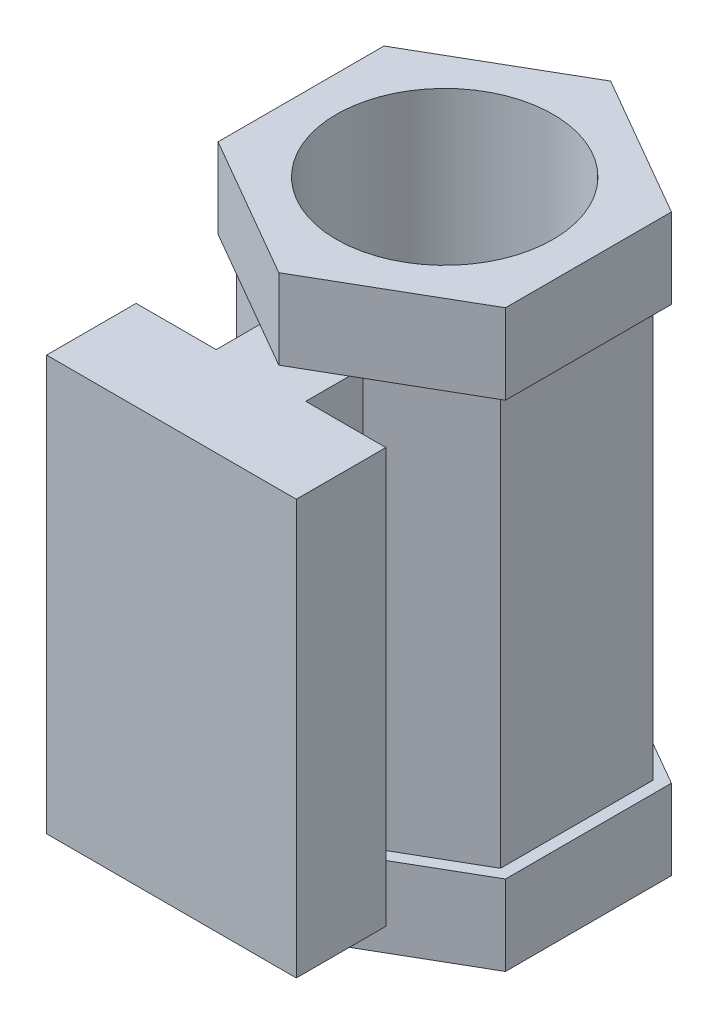
ISO-10303-21;
HEADER;
FILE_DESCRIPTION(('STEP AP214'),'2;1');
FILE_NAME('part.step','',(''),(''),'','','');
FILE_SCHEMA(('AUTOMOTIVE_DESIGN { 1 0 10303 214 1 1 1 1 }'));
ENDSEC;
DATA;
#1=APPLICATION_CONTEXT('core data for automotive mechanical design processes');
#2=APPLICATION_PROTOCOL_DEFINITION('international standard','automotive_design',2000,#1);
#3=PRODUCT_CONTEXT('',#1,'mechanical');
#4=PRODUCT('Part','Part','',(#3));
#5=PRODUCT_RELATED_PRODUCT_CATEGORY('part','',(#4));
#6=PRODUCT_DEFINITION_FORMATION('','',#4);
#7=PRODUCT_DEFINITION_CONTEXT('part definition',#1,'design');
#8=PRODUCT_DEFINITION('design','',#6,#7);
#9=PRODUCT_DEFINITION_SHAPE('','',#8);
#10=(LENGTH_UNIT() NAMED_UNIT(*) SI_UNIT(.MILLI.,.METRE.));
#11=(NAMED_UNIT(*) PLANE_ANGLE_UNIT() SI_UNIT($,.RADIAN.));
#12=(NAMED_UNIT(*) SI_UNIT($,.STERADIAN.) SOLID_ANGLE_UNIT());
#13=UNCERTAINTY_MEASURE_WITH_UNIT(LENGTH_MEASURE(1.E-05),#10,'distance_accuracy_value','');
#14=(GEOMETRIC_REPRESENTATION_CONTEXT(3) GLOBAL_UNCERTAINTY_ASSIGNED_CONTEXT((#13)) GLOBAL_UNIT_ASSIGNED_CONTEXT((#10,
#11,#12)) REPRESENTATION_CONTEXT('',''));
#15=CARTESIAN_POINT('',(0.,0.,0.));
#16=DIRECTION('',(0.,0.,1.));
#17=DIRECTION('',(1.,0.,0.));
#18=AXIS2_PLACEMENT_3D('',#15,#16,#17);
#19=CARTESIAN_POINT('',(152.5,85.,-88.045916051418));
#20=DIRECTION('',(-0.5,0.,0.866025403784439));
#21=DIRECTION('',(0.866025403784439,0.,0.5));
#22=AXIS2_PLACEMENT_3D('',#19,#20,#21);
#23=PLANE('',#22);
#24=DIRECTION('',(-0.866025403784439,0.,-0.5));
#25=VECTOR('',#24,1.);
#26=CARTESIAN_POINT('',(152.5,0.,-88.045916051418));
#27=LINE('',#26,#25);
#28=CARTESIAN_POINT('',(152.5,0.,-88.045916051418));
#29=VERTEX_POINT('',#28);
#30=CARTESIAN_POINT('',(0.,0.,-176.091832102836));
#31=VERTEX_POINT('',#30);
#32=EDGE_CURVE('E325',#29,#31,#27,.T.);
#33=ORIENTED_EDGE('',*,*,#32,.T.);
#34=DIRECTION('',(0.,-1.,0.));
#35=VECTOR('',#34,1.);
#36=CARTESIAN_POINT('',(0.,85.,-176.091832102836));
#37=LINE('',#36,#35);
#38=CARTESIAN_POINT('',(0.,85.,-176.091832102836));
#39=VERTEX_POINT('',#38);
#40=EDGE_CURVE('E38',#39,#31,#37,.T.);
#41=ORIENTED_EDGE('',*,*,#40,.F.);
#42=DIRECTION('',(-0.866025403784439,0.,-0.5));
#43=VECTOR('',#42,1.);
#44=CARTESIAN_POINT('',(152.5,85.,-88.045916051418));
#45=LINE('',#44,#43);
#46=CARTESIAN_POINT('',(152.5,85.,-88.045916051418));
#47=VERTEX_POINT('',#46);
#48=EDGE_CURVE('E350',#47,#39,#45,.T.);
#49=ORIENTED_EDGE('',*,*,#48,.F.);
#50=DIRECTION('',(0.,-1.,0.));
#51=VECTOR('',#50,1.);
#52=CARTESIAN_POINT('',(152.5,85.,-88.045916051418));
#53=LINE('',#52,#51);
#54=EDGE_CURVE('E364',#47,#29,#53,.T.);
#55=ORIENTED_EDGE('',*,*,#54,.T.);
#56=EDGE_LOOP('',(#33,#41,#49,#55));
#57=FACE_BOUND('',#56,.T.);
#58=ADVANCED_FACE('F35',(#57),#23,.F.);
#59=CARTESIAN_POINT('',(0.,85.,-176.091832102836));
#60=DIRECTION('',(0.5,0.,0.866025403784439));
#61=DIRECTION('',(0.866025403784439,0.,-0.5));
#62=AXIS2_PLACEMENT_3D('',#59,#60,#61);
#63=PLANE('',#62);
#64=DIRECTION('',(-0.866025403784438,0.,0.5));
#65=VECTOR('',#64,1.);
#66=CARTESIAN_POINT('',(0.,0.,-176.091832102836));
#67=LINE('',#66,#65);
#68=CARTESIAN_POINT('',(-152.5,0.,-88.045916051418));
#69=VERTEX_POINT('',#68);
#70=EDGE_CURVE('E367',#31,#69,#67,.T.);
#71=ORIENTED_EDGE('',*,*,#70,.T.);
#72=DIRECTION('',(0.,-1.,0.));
#73=VECTOR('',#72,1.);
#74=CARTESIAN_POINT('',(-152.5,85.,-88.045916051418));
#75=LINE('',#74,#73);
#76=CARTESIAN_POINT('',(-152.5,85.,-88.045916051418));
#77=VERTEX_POINT('',#76);
#78=EDGE_CURVE('E390',#77,#69,#75,.T.);
#79=ORIENTED_EDGE('',*,*,#78,.F.);
#80=DIRECTION('',(-0.866025403784438,0.,0.5));
#81=VECTOR('',#80,1.);
#82=CARTESIAN_POINT('',(0.,85.,-176.091832102836));
#83=LINE('',#82,#81);
#84=EDGE_CURVE('E353',#39,#77,#83,.T.);
#85=ORIENTED_EDGE('',*,*,#84,.F.);
#86=ORIENTED_EDGE('',*,*,#40,.T.);
#87=EDGE_LOOP('',(#71,#79,#85,#86));
#88=FACE_BOUND('',#87,.T.);
#89=ADVANCED_FACE('F509',(#88),#63,.F.);
#90=CARTESIAN_POINT('',(-152.5,85.,-88.045916051418));
#91=DIRECTION('',(1.,0.,0.));
#92=DIRECTION('',(0.,0.,-1.));
#93=AXIS2_PLACEMENT_3D('',#90,#91,#92);
#94=PLANE('',#93);
#95=DIRECTION('',(0.,0.,1.));
#96=VECTOR('',#95,1.);
#97=CARTESIAN_POINT('',(-152.5,0.,-88.045916051418));
#98=LINE('',#97,#96);
#99=CARTESIAN_POINT('',(-152.5,0.,88.0459160514179));
#100=VERTEX_POINT('',#99);
#101=EDGE_CURVE('E369',#69,#100,#98,.T.);
#102=ORIENTED_EDGE('',*,*,#101,.T.);
#103=DIRECTION('',(0.,-1.,0.));
#104=VECTOR('',#103,1.);
#105=CARTESIAN_POINT('',(-152.5,85.,88.0459160514179));
#106=LINE('',#105,#104);
#107=CARTESIAN_POINT('',(-152.5,85.,88.0459160514179));
#108=VERTEX_POINT('',#107);
#109=EDGE_CURVE('E388',#108,#100,#106,.T.);
#110=ORIENTED_EDGE('',*,*,#109,.F.);
#111=DIRECTION('',(0.,0.,1.));
#112=VECTOR('',#111,1.);
#113=CARTESIAN_POINT('',(-152.5,85.,-88.045916051418));
#114=LINE('',#113,#112);
#115=EDGE_CURVE('E356',#77,#108,#114,.T.);
#116=ORIENTED_EDGE('',*,*,#115,.F.);
#117=ORIENTED_EDGE('',*,*,#78,.T.);
#118=EDGE_LOOP('',(#102,#110,#116,#117));
#119=FACE_BOUND('',#118,.T.);
#120=ADVANCED_FACE('F511',(#119),#94,.F.);
#121=CARTESIAN_POINT('',(-152.5,85.,88.0459160514179));
#122=DIRECTION('',(0.5,0.,-0.866025403784439));
#123=DIRECTION('',(-0.866025403784439,0.,-0.5));
#124=AXIS2_PLACEMENT_3D('',#121,#122,#123);
#125=PLANE('',#124);
#126=DIRECTION('',(0.866025403784438,0.,0.5));
#127=VECTOR('',#126,1.);
#128=CARTESIAN_POINT('',(-152.5,0.,88.0459160514179));
#129=LINE('',#128,#127);
#130=CARTESIAN_POINT('',(-47.5,0.,148.667694316329));
#131=VERTEX_POINT('',#130);
#132=EDGE_CURVE('E372',#100,#131,#129,.T.);
#133=ORIENTED_EDGE('',*,*,#132,.T.);
#134=CARTESIAN_POINT('',(0.,0.,176.091832102836));
#135=VERTEX_POINT('',#134);
#136=EDGE_CURVE('E371',#131,#135,#129,.T.);
#137=ORIENTED_EDGE('',*,*,#136,.T.);
#138=DIRECTION('',(0.,-1.,0.));
#139=VECTOR('',#138,1.);
#140=CARTESIAN_POINT('',(0.,85.,176.091832102836));
#141=LINE('',#140,#139);
#142=CARTESIAN_POINT('',(0.,85.,176.091832102836));
#143=VERTEX_POINT('',#142);
#144=EDGE_CURVE('E385',#143,#135,#141,.T.);
#145=ORIENTED_EDGE('',*,*,#144,.F.);
#146=DIRECTION('',(0.866025403784438,0.,0.5));
#147=VECTOR('',#146,1.);
#148=CARTESIAN_POINT('',(-152.5,85.,88.0459160514179));
#149=LINE('',#148,#147);
#150=EDGE_CURVE('E358',#108,#143,#149,.T.);
#151=ORIENTED_EDGE('',*,*,#150,.F.);
#152=ORIENTED_EDGE('',*,*,#109,.T.);
#153=EDGE_LOOP('',(#133,#137,#145,#151,#152));
#154=FACE_BOUND('',#153,.T.);
#155=ADVANCED_FACE('F517',(#154),#125,.F.);
#156=CARTESIAN_POINT('',(0.,85.,176.091832102836));
#157=DIRECTION('',(-0.5,0.,-0.866025403784439));
#158=DIRECTION('',(-0.866025403784439,0.,0.5));
#159=AXIS2_PLACEMENT_3D('',#156,#157,#158);
#160=PLANE('',#159);
#161=DIRECTION('',(0.866025403784439,0.,-0.5));
#162=VECTOR('',#161,1.);
#163=CARTESIAN_POINT('',(0.,0.,176.091832102836));
#164=LINE('',#163,#162);
#165=CARTESIAN_POINT('',(47.5,0.,148.667694316329));
#166=VERTEX_POINT('',#165);
#167=EDGE_CURVE('E376',#135,#166,#164,.T.);
#168=ORIENTED_EDGE('',*,*,#167,.T.);
#169=CARTESIAN_POINT('',(152.5,0.,88.0459160514179));
#170=VERTEX_POINT('',#169);
#171=EDGE_CURVE('E375',#166,#170,#164,.T.);
#172=ORIENTED_EDGE('',*,*,#171,.T.);
#173=DIRECTION('',(0.,-1.,0.));
#174=VECTOR('',#173,1.);
#175=CARTESIAN_POINT('',(152.5,85.,88.0459160514179));
#176=LINE('',#175,#174);
#177=CARTESIAN_POINT('',(152.5,85.,88.0459160514179));
#178=VERTEX_POINT('',#177);
#179=EDGE_CURVE('E382',#178,#170,#176,.T.);
#180=ORIENTED_EDGE('',*,*,#179,.F.);
#181=DIRECTION('',(0.866025403784439,0.,-0.5));
#182=VECTOR('',#181,1.);
#183=CARTESIAN_POINT('',(0.,85.,176.091832102836));
#184=LINE('',#183,#182);
#185=EDGE_CURVE('E360',#143,#178,#184,.T.);
#186=ORIENTED_EDGE('',*,*,#185,.F.);
#187=ORIENTED_EDGE('',*,*,#144,.T.);
#188=EDGE_LOOP('',(#168,#172,#180,#186,#187));
#189=FACE_BOUND('',#188,.T.);
#190=ADVANCED_FACE('F519',(#189),#160,.F.);
#191=CARTESIAN_POINT('',(152.5,85.,88.0459160514179));
#192=DIRECTION('',(-1.,0.,0.));
#193=DIRECTION('',(0.,0.,1.));
#194=AXIS2_PLACEMENT_3D('',#191,#192,#193);
#195=PLANE('',#194);
#196=DIRECTION('',(0.,0.,-1.));
#197=VECTOR('',#196,1.);
#198=CARTESIAN_POINT('',(152.5,0.,88.0459160514179));
#199=LINE('',#198,#197);
#200=EDGE_CURVE('E354',#170,#29,#199,.T.);
#201=ORIENTED_EDGE('',*,*,#200,.T.);
#202=ORIENTED_EDGE('',*,*,#54,.F.);
#203=DIRECTION('',(0.,0.,-1.));
#204=VECTOR('',#203,1.);
#205=CARTESIAN_POINT('',(152.5,85.,88.0459160514179));
#206=LINE('',#205,#204);
#207=EDGE_CURVE('E362',#178,#47,#206,.T.);
#208=ORIENTED_EDGE('',*,*,#207,.F.);
#209=ORIENTED_EDGE('',*,*,#179,.T.);
#210=EDGE_LOOP('',(#201,#202,#208,#209));
#211=FACE_BOUND('',#210,.T.);
#212=ADVANCED_FACE('F501',(#211),#195,.F.);
#213=CARTESIAN_POINT('',(0.,85.,0.));
#214=DIRECTION('',(0.,1.,0.));
#215=DIRECTION('',(0.,0.,1.));
#216=AXIS2_PLACEMENT_3D('',#213,#214,#215);
#217=PLANE('',#216);
#218=CARTESIAN_POINT('',(0.,85.,0.));
#219=DIRECTION('',(0.,1.,0.));
#220=DIRECTION('',(0.,0.,1.));
#221=AXIS2_PLACEMENT_3D('',#218,#219,#220);
#222=CIRCLE('',#221,115.);
#223=CARTESIAN_POINT('',(0.,85.,115.));
#224=VERTEX_POINT('',#223);
#225=EDGE_CURVE('E485',#224,#224,#222,.T.);
#226=ORIENTED_EDGE('',*,*,#225,.F.);
#227=EDGE_LOOP('',(#226));
#228=FACE_BOUND('',#227,.T.);
#229=ORIENTED_EDGE('',*,*,#48,.T.);
#230=ORIENTED_EDGE('',*,*,#84,.T.);
#231=ORIENTED_EDGE('',*,*,#115,.T.);
#232=ORIENTED_EDGE('',*,*,#150,.T.);
#233=ORIENTED_EDGE('',*,*,#185,.T.);
#234=ORIENTED_EDGE('',*,*,#207,.T.);
#235=EDGE_LOOP('',(#229,#230,#231,#232,#233,#234));
#236=FACE_BOUND('',#235,.T.);
#237=ADVANCED_FACE('F498',(#228,#236),#217,.T.);
#238=CARTESIAN_POINT('',(0.,0.,0.));
#239=DIRECTION('',(0.,1.,0.));
#240=DIRECTION('',(0.,0.,1.));
#241=AXIS2_PLACEMENT_3D('',#238,#239,#240);
#242=PLANE('',#241);
#243=ORIENTED_EDGE('',*,*,#171,.F.);
#244=DIRECTION('',(0.,0.,-1.));
#245=VECTOR('',#244,1.);
#246=CARTESIAN_POINT('',(47.5,0.,195.));
#247=LINE('',#246,#245);
#248=CARTESIAN_POINT('',(47.5,0.,134.233937586588));
#249=VERTEX_POINT('',#248);
#250=EDGE_CURVE('E43',#166,#249,#247,.T.);
#251=ORIENTED_EDGE('',*,*,#250,.T.);
#252=DIRECTION('',(0.866025403784439,0.,-0.5));
#253=VECTOR('',#252,1.);
#254=CARTESIAN_POINT('',(47.5,0.,134.233937586588));
#255=LINE('',#254,#253);
#256=CARTESIAN_POINT('',(140.,0.,80.8290376865476));
#257=VERTEX_POINT('',#256);
#258=EDGE_CURVE('E290',#249,#257,#255,.T.);
#259=ORIENTED_EDGE('',*,*,#258,.T.);
#260=DIRECTION('',(0.,0.,-1.));
#261=VECTOR('',#260,1.);
#262=CARTESIAN_POINT('',(140.,0.,80.8290376865476));
#263=LINE('',#262,#261);
#264=CARTESIAN_POINT('',(140.,0.,-80.8290376865477));
#265=VERTEX_POINT('',#264);
#266=EDGE_CURVE('E293',#257,#265,#263,.T.);
#267=ORIENTED_EDGE('',*,*,#266,.T.);
#268=DIRECTION('',(-0.866025403784439,0.,-0.5));
#269=VECTOR('',#268,1.);
#270=CARTESIAN_POINT('',(140.,0.,-80.8290376865477));
#271=LINE('',#270,#269);
#272=CARTESIAN_POINT('',(0.,0.,-161.658075373095));
#273=VERTEX_POINT('',#272);
#274=EDGE_CURVE('E296',#265,#273,#271,.T.);
#275=ORIENTED_EDGE('',*,*,#274,.T.);
#276=DIRECTION('',(-0.866025403784439,0.,0.5));
#277=VECTOR('',#276,1.);
#278=CARTESIAN_POINT('',(0.,0.,-161.658075373095));
#279=LINE('',#278,#277);
#280=CARTESIAN_POINT('',(-140.,0.,-80.8290376865477));
#281=VERTEX_POINT('',#280);
#282=EDGE_CURVE('E299',#273,#281,#279,.T.);
#283=ORIENTED_EDGE('',*,*,#282,.T.);
#284=DIRECTION('',(0.,0.,1.));
#285=VECTOR('',#284,1.);
#286=CARTESIAN_POINT('',(-140.,0.,-80.8290376865477));
#287=LINE('',#286,#285);
#288=CARTESIAN_POINT('',(-140.,0.,80.8290376865476));
#289=VERTEX_POINT('',#288);
#290=EDGE_CURVE('E302',#281,#289,#287,.T.);
#291=ORIENTED_EDGE('',*,*,#290,.T.);
#292=DIRECTION('',(0.866025403784439,0.,0.5));
#293=VECTOR('',#292,1.);
#294=CARTESIAN_POINT('',(-140.,0.,80.8290376865476));
#295=LINE('',#294,#293);
#296=CARTESIAN_POINT('',(-47.5,0.,134.233937586588));
#297=VERTEX_POINT('',#296);
#298=EDGE_CURVE('E305',#289,#297,#295,.T.);
#299=ORIENTED_EDGE('',*,*,#298,.T.);
#300=DIRECTION('',(0.,0.,1.));
#301=VECTOR('',#300,1.);
#302=CARTESIAN_POINT('',(-47.5,0.,195.));
#303=LINE('',#302,#301);
#304=EDGE_CURVE('E309',#297,#131,#303,.T.);
#305=ORIENTED_EDGE('',*,*,#304,.T.);
#306=ORIENTED_EDGE('',*,*,#132,.F.);
#307=ORIENTED_EDGE('',*,*,#101,.F.);
#308=ORIENTED_EDGE('',*,*,#70,.F.);
#309=ORIENTED_EDGE('',*,*,#32,.F.);
#310=ORIENTED_EDGE('',*,*,#200,.F.);
#311=EDGE_LOOP('',(#243,#251,#259,#267,#275,#283,#291,#299,#305,#306,#307,#308,#309,#310));
#312=FACE_BOUND('',#311,.T.);
#313=ADVANCED_FACE('F402',(#312),#242,.F.);
#314=CARTESIAN_POINT('',(132.5,-440.,195.));
#315=DIRECTION('',(0.,0.,-1.));
#316=DIRECTION('',(-1.,0.,0.));
#317=AXIS2_PLACEMENT_3D('',#314,#315,#316);
#318=PLANE('',#317);
#319=DIRECTION('',(-1.,0.,0.));
#320=VECTOR('',#319,1.);
#321=CARTESIAN_POINT('',(132.5,0.,195.));
#322=LINE('',#321,#320);
#323=CARTESIAN_POINT('',(132.5,0.,195.));
#324=VERTEX_POINT('',#323);
#325=CARTESIAN_POINT('',(47.5,0.,195.));
#326=VERTEX_POINT('',#325);
#327=EDGE_CURVE('E239',#324,#326,#322,.T.);
#328=ORIENTED_EDGE('',*,*,#327,.F.);
#329=DIRECTION('',(0.,1.,0.));
#330=VECTOR('',#329,1.);
#331=CARTESIAN_POINT('',(132.5,-440.,195.));
#332=LINE('',#331,#330);
#333=CARTESIAN_POINT('',(132.5,-440.,195.));
#334=VERTEX_POINT('',#333);
#335=EDGE_CURVE('E323',#334,#324,#332,.T.);
#336=ORIENTED_EDGE('',*,*,#335,.F.);
#337=DIRECTION('',(-1.,0.,0.));
#338=VECTOR('',#337,1.);
#339=CARTESIAN_POINT('',(132.5,-440.,195.));
#340=LINE('',#339,#338);
#341=CARTESIAN_POINT('',(47.5,-440.,195.));
#342=VERTEX_POINT('',#341);
#343=EDGE_CURVE('E248',#334,#342,#340,.T.);
#344=ORIENTED_EDGE('',*,*,#343,.T.);
#345=DIRECTION('',(0.,1.,0.));
#346=VECTOR('',#345,1.);
#347=CARTESIAN_POINT('',(47.5,-440.,195.));
#348=LINE('',#347,#346);
#349=EDGE_CURVE('E286',#342,#326,#348,.T.);
#350=ORIENTED_EDGE('',*,*,#349,.T.);
#351=EDGE_LOOP('',(#328,#336,#344,#350));
#352=FACE_BOUND('',#351,.T.);
#353=ADVANCED_FACE('F416',(#352),#318,.T.);
#354=CARTESIAN_POINT('',(132.5,-440.,290.));
#355=DIRECTION('',(1.,0.,0.));
#356=DIRECTION('',(0.,0.,-1.));
#357=AXIS2_PLACEMENT_3D('',#354,#355,#356);
#358=PLANE('',#357);
#359=DIRECTION('',(0.,0.,-1.));
#360=VECTOR('',#359,1.);
#361=CARTESIAN_POINT('',(132.5,0.,290.));
#362=LINE('',#361,#360);
#363=CARTESIAN_POINT('',(132.5,0.,290.));
#364=VERTEX_POINT('',#363);
#365=EDGE_CURVE('E252',#364,#324,#362,.T.);
#366=ORIENTED_EDGE('',*,*,#365,.F.);
#367=DIRECTION('',(0.,1.,0.));
#368=VECTOR('',#367,1.);
#369=CARTESIAN_POINT('',(132.5,-440.,290.));
#370=LINE('',#369,#368);
#371=CARTESIAN_POINT('',(132.5,-440.,290.));
#372=VERTEX_POINT('',#371);
#373=EDGE_CURVE('E326',#372,#364,#370,.T.);
#374=ORIENTED_EDGE('',*,*,#373,.F.);
#375=DIRECTION('',(0.,0.,-1.));
#376=VECTOR('',#375,1.);
#377=CARTESIAN_POINT('',(132.5,-440.,290.));
#378=LINE('',#377,#376);
#379=EDGE_CURVE('E284',#372,#334,#378,.T.);
#380=ORIENTED_EDGE('',*,*,#379,.T.);
#381=ORIENTED_EDGE('',*,*,#335,.T.);
#382=EDGE_LOOP('',(#366,#374,#380,#381));
#383=FACE_BOUND('',#382,.T.);
#384=ADVANCED_FACE('F423',(#383),#358,.T.);
#385=CARTESIAN_POINT('',(132.5,-440.,290.));
#386=DIRECTION('',(0.,0.,1.));
#387=DIRECTION('',(1.,0.,0.));
#388=AXIS2_PLACEMENT_3D('',#385,#386,#387);
#389=PLANE('',#388);
#390=DIRECTION('',(1.,0.,0.));
#391=VECTOR('',#390,1.);
#392=CARTESIAN_POINT('',(132.5,0.,290.));
#393=LINE('',#392,#391);
#394=CARTESIAN_POINT('',(-132.5,0.,290.));
#395=VERTEX_POINT('',#394);
#396=EDGE_CURVE('E318',#395,#364,#393,.T.);
#397=ORIENTED_EDGE('',*,*,#396,.F.);
#398=DIRECTION('',(0.,1.,0.));
#399=VECTOR('',#398,1.);
#400=CARTESIAN_POINT('',(-132.5,-440.,290.));
#401=LINE('',#400,#399);
#402=CARTESIAN_POINT('',(-132.5,-440.,290.));
#403=VERTEX_POINT('',#402);
#404=EDGE_CURVE('E328',#403,#395,#401,.T.);
#405=ORIENTED_EDGE('',*,*,#404,.F.);
#406=DIRECTION('',(1.,0.,0.));
#407=VECTOR('',#406,1.);
#408=CARTESIAN_POINT('',(132.5,-440.,290.));
#409=LINE('',#408,#407);
#410=EDGE_CURVE('E281',#403,#372,#409,.T.);
#411=ORIENTED_EDGE('',*,*,#410,.T.);
#412=ORIENTED_EDGE('',*,*,#373,.T.);
#413=EDGE_LOOP('',(#397,#405,#411,#412));
#414=FACE_BOUND('',#413,.T.);
#415=ADVANCED_FACE('F426',(#414),#389,.T.);
#416=CARTESIAN_POINT('',(-132.5,-440.,290.));
#417=DIRECTION('',(-1.,0.,0.));
#418=DIRECTION('',(0.,0.,1.));
#419=AXIS2_PLACEMENT_3D('',#416,#417,#418);
#420=PLANE('',#419);
#421=DIRECTION('',(0.,0.,1.));
#422=VECTOR('',#421,1.);
#423=CARTESIAN_POINT('',(-132.5,0.,290.));
#424=LINE('',#423,#422);
#425=CARTESIAN_POINT('',(-132.5,0.,195.));
#426=VERTEX_POINT('',#425);
#427=EDGE_CURVE('E315',#426,#395,#424,.T.);
#428=ORIENTED_EDGE('',*,*,#427,.F.);
#429=DIRECTION('',(0.,1.,0.));
#430=VECTOR('',#429,1.);
#431=CARTESIAN_POINT('',(-132.5,-440.,195.));
#432=LINE('',#431,#430);
#433=CARTESIAN_POINT('',(-132.5,-440.,195.));
#434=VERTEX_POINT('',#433);
#435=EDGE_CURVE('E330',#434,#426,#432,.T.);
#436=ORIENTED_EDGE('',*,*,#435,.F.);
#437=DIRECTION('',(0.,0.,1.));
#438=VECTOR('',#437,1.);
#439=CARTESIAN_POINT('',(-132.5,-440.,290.));
#440=LINE('',#439,#438);
#441=EDGE_CURVE('E278',#434,#403,#440,.T.);
#442=ORIENTED_EDGE('',*,*,#441,.T.);
#443=ORIENTED_EDGE('',*,*,#404,.T.);
#444=EDGE_LOOP('',(#428,#436,#442,#443));
#445=FACE_BOUND('',#444,.T.);
#446=ADVANCED_FACE('F430',(#445),#420,.T.);
#447=CARTESIAN_POINT('',(-132.5,-440.,195.));
#448=DIRECTION('',(0.,0.,-1.));
#449=DIRECTION('',(-1.,0.,0.));
#450=AXIS2_PLACEMENT_3D('',#447,#448,#449);
#451=PLANE('',#450);
#452=DIRECTION('',(-1.,0.,0.));
#453=VECTOR('',#452,1.);
#454=CARTESIAN_POINT('',(-132.5,0.,195.));
#455=LINE('',#454,#453);
#456=CARTESIAN_POINT('',(-47.5,0.,195.));
#457=VERTEX_POINT('',#456);
#458=EDGE_CURVE('E312',#457,#426,#455,.T.);
#459=ORIENTED_EDGE('',*,*,#458,.F.);
#460=DIRECTION('',(0.,1.,0.));
#461=VECTOR('',#460,1.);
#462=CARTESIAN_POINT('',(-47.5,-440.,195.));
#463=LINE('',#462,#461);
#464=CARTESIAN_POINT('',(-47.5,-440.,195.));
#465=VERTEX_POINT('',#464);
#466=EDGE_CURVE('E332',#465,#457,#463,.T.);
#467=ORIENTED_EDGE('',*,*,#466,.F.);
#468=DIRECTION('',(-1.,0.,0.));
#469=VECTOR('',#468,1.);
#470=CARTESIAN_POINT('',(-132.5,-440.,195.));
#471=LINE('',#470,#469);
#472=EDGE_CURVE('E275',#465,#434,#471,.T.);
#473=ORIENTED_EDGE('',*,*,#472,.T.);
#474=ORIENTED_EDGE('',*,*,#435,.T.);
#475=EDGE_LOOP('',(#459,#467,#473,#474));
#476=FACE_BOUND('',#475,.T.);
#477=ADVANCED_FACE('F433',(#476),#451,.T.);
#478=CARTESIAN_POINT('',(-47.5,-440.,195.));
#479=DIRECTION('',(-1.,0.,0.));
#480=DIRECTION('',(0.,0.,1.));
#481=AXIS2_PLACEMENT_3D('',#478,#479,#480);
#482=PLANE('',#481);
#483=ORIENTED_EDGE('',*,*,#304,.F.);
#484=DIRECTION('',(0.,1.,0.));
#485=VECTOR('',#484,1.);
#486=CARTESIAN_POINT('',(-47.5,-440.,134.233937586588));
#487=LINE('',#486,#485);
#488=CARTESIAN_POINT('',(-47.5,-440.,134.233937586588));
#489=VERTEX_POINT('',#488);
#490=EDGE_CURVE('E335',#489,#297,#487,.T.);
#491=ORIENTED_EDGE('',*,*,#490,.F.);
#492=DIRECTION('',(0.,0.,1.));
#493=VECTOR('',#492,1.);
#494=CARTESIAN_POINT('',(-47.5,-440.,195.));
#495=LINE('',#494,#493);
#496=CARTESIAN_POINT('',(-47.5,-440.,148.66769431633));
#497=VERTEX_POINT('',#496);
#498=EDGE_CURVE('E273',#489,#497,#495,.T.);
#499=ORIENTED_EDGE('',*,*,#498,.T.);
#500=EDGE_CURVE('E56',#497,#465,#495,.T.);
#501=ORIENTED_EDGE('',*,*,#500,.T.);
#502=ORIENTED_EDGE('',*,*,#466,.T.);
#503=EDGE_CURVE('E308',#131,#457,#303,.T.);
#504=ORIENTED_EDGE('',*,*,#503,.F.);
#505=EDGE_LOOP('',(#483,#491,#499,#501,#502,#504));
#506=FACE_BOUND('',#505,.T.);
#507=ADVANCED_FACE('F437',(#506),#482,.T.);
#508=CARTESIAN_POINT('',(-140.,-440.,80.8290376865476));
#509=DIRECTION('',(-0.5,0.,0.866025403784439));
#510=DIRECTION('',(0.866025403784439,0.,0.5));
#511=AXIS2_PLACEMENT_3D('',#508,#509,#510);
#512=PLANE('',#511);
#513=ORIENTED_EDGE('',*,*,#298,.F.);
#514=DIRECTION('',(0.,1.,0.));
#515=VECTOR('',#514,1.);
#516=CARTESIAN_POINT('',(-140.,-440.,80.8290376865476));
#517=LINE('',#516,#515);
#518=CARTESIAN_POINT('',(-140.,-440.,80.8290376865476));
#519=VERTEX_POINT('',#518);
#520=EDGE_CURVE('E337',#519,#289,#517,.T.);
#521=ORIENTED_EDGE('',*,*,#520,.F.);
#522=DIRECTION('',(0.866025403784439,0.,0.5));
#523=VECTOR('',#522,1.);
#524=CARTESIAN_POINT('',(-140.,-440.,80.8290376865476));
#525=LINE('',#524,#523);
#526=EDGE_CURVE('E270',#519,#489,#525,.T.);
#527=ORIENTED_EDGE('',*,*,#526,.T.);
#528=ORIENTED_EDGE('',*,*,#490,.T.);
#529=EDGE_LOOP('',(#513,#521,#527,#528));
#530=FACE_BOUND('',#529,.T.);
#531=ADVANCED_FACE('F616',(#530),#512,.T.);
#532=CARTESIAN_POINT('',(-140.,-440.,-80.8290376865477));
#533=DIRECTION('',(-1.,0.,0.));
#534=DIRECTION('',(0.,0.,1.));
#535=AXIS2_PLACEMENT_3D('',#532,#533,#534);
#536=PLANE('',#535);
#537=ORIENTED_EDGE('',*,*,#290,.F.);
#538=DIRECTION('',(0.,1.,0.));
#539=VECTOR('',#538,1.);
#540=CARTESIAN_POINT('',(-140.,-440.,-80.8290376865477));
#541=LINE('',#540,#539);
#542=CARTESIAN_POINT('',(-140.,-440.,-80.8290376865477));
#543=VERTEX_POINT('',#542);
#544=EDGE_CURVE('E339',#543,#281,#541,.T.);
#545=ORIENTED_EDGE('',*,*,#544,.F.);
#546=DIRECTION('',(0.,0.,1.));
#547=VECTOR('',#546,1.);
#548=CARTESIAN_POINT('',(-140.,-440.,-80.8290376865477));
#549=LINE('',#548,#547);
#550=EDGE_CURVE('E267',#543,#519,#549,.T.);
#551=ORIENTED_EDGE('',*,*,#550,.T.);
#552=ORIENTED_EDGE('',*,*,#520,.T.);
#553=EDGE_LOOP('',(#537,#545,#551,#552));
#554=FACE_BOUND('',#553,.T.);
#555=ADVANCED_FACE('F625',(#554),#536,.T.);
#556=CARTESIAN_POINT('',(0.,-440.,-161.658075373095));
#557=DIRECTION('',(-0.5,0.,-0.866025403784439));
#558=DIRECTION('',(-0.866025403784439,0.,0.5));
#559=AXIS2_PLACEMENT_3D('',#556,#557,#558);
#560=PLANE('',#559);
#561=ORIENTED_EDGE('',*,*,#282,.F.);
#562=DIRECTION('',(0.,1.,0.));
#563=VECTOR('',#562,1.);
#564=CARTESIAN_POINT('',(0.,-440.,-161.658075373095));
#565=LINE('',#564,#563);
#566=CARTESIAN_POINT('',(0.,-440.,-161.658075373095));
#567=VERTEX_POINT('',#566);
#568=EDGE_CURVE('E341',#567,#273,#565,.T.);
#569=ORIENTED_EDGE('',*,*,#568,.F.);
#570=DIRECTION('',(-0.866025403784439,0.,0.5));
#571=VECTOR('',#570,1.);
#572=CARTESIAN_POINT('',(0.,-440.,-161.658075373095));
#573=LINE('',#572,#571);
#574=EDGE_CURVE('E264',#567,#543,#573,.T.);
#575=ORIENTED_EDGE('',*,*,#574,.T.);
#576=ORIENTED_EDGE('',*,*,#544,.T.);
#577=EDGE_LOOP('',(#561,#569,#575,#576));
#578=FACE_BOUND('',#577,.T.);
#579=ADVANCED_FACE('F635',(#578),#560,.T.);
#580=CARTESIAN_POINT('',(140.,-440.,-80.8290376865477));
#581=DIRECTION('',(0.5,0.,-0.866025403784439));
#582=DIRECTION('',(-0.866025403784439,0.,-0.5));
#583=AXIS2_PLACEMENT_3D('',#580,#581,#582);
#584=PLANE('',#583);
#585=ORIENTED_EDGE('',*,*,#274,.F.);
#586=DIRECTION('',(0.,1.,0.));
#587=VECTOR('',#586,1.);
#588=CARTESIAN_POINT('',(140.,-440.,-80.8290376865477));
#589=LINE('',#588,#587);
#590=CARTESIAN_POINT('',(140.,-440.,-80.8290376865477));
#591=VERTEX_POINT('',#590);
#592=EDGE_CURVE('E343',#591,#265,#589,.T.);
#593=ORIENTED_EDGE('',*,*,#592,.F.);
#594=DIRECTION('',(-0.866025403784439,0.,-0.5));
#595=VECTOR('',#594,1.);
#596=CARTESIAN_POINT('',(140.,-440.,-80.8290376865477));
#597=LINE('',#596,#595);
#598=EDGE_CURVE('E261',#591,#567,#597,.T.);
#599=ORIENTED_EDGE('',*,*,#598,.T.);
#600=ORIENTED_EDGE('',*,*,#568,.T.);
#601=EDGE_LOOP('',(#585,#593,#599,#600));
#602=FACE_BOUND('',#601,.T.);
#603=ADVANCED_FACE('F645',(#602),#584,.T.);
#604=CARTESIAN_POINT('',(140.,-440.,80.8290376865476));
#605=DIRECTION('',(1.,0.,0.));
#606=DIRECTION('',(0.,0.,-1.));
#607=AXIS2_PLACEMENT_3D('',#604,#605,#606);
#608=PLANE('',#607);
#609=ORIENTED_EDGE('',*,*,#266,.F.);
#610=DIRECTION('',(0.,1.,0.));
#611=VECTOR('',#610,1.);
#612=CARTESIAN_POINT('',(140.,-440.,80.8290376865476));
#613=LINE('',#612,#611);
#614=CARTESIAN_POINT('',(140.,-440.,80.8290376865476));
#615=VERTEX_POINT('',#614);
#616=EDGE_CURVE('E345',#615,#257,#613,.T.);
#617=ORIENTED_EDGE('',*,*,#616,.F.);
#618=DIRECTION('',(0.,0.,-1.));
#619=VECTOR('',#618,1.);
#620=CARTESIAN_POINT('',(140.,-440.,80.8290376865476));
#621=LINE('',#620,#619);
#622=EDGE_CURVE('E258',#615,#591,#621,.T.);
#623=ORIENTED_EDGE('',*,*,#622,.T.);
#624=ORIENTED_EDGE('',*,*,#592,.T.);
#625=EDGE_LOOP('',(#609,#617,#623,#624));
#626=FACE_BOUND('',#625,.T.);
#627=ADVANCED_FACE('F655',(#626),#608,.T.);
#628=CARTESIAN_POINT('',(47.5,-440.,134.233937586588));
#629=DIRECTION('',(0.5,0.,0.866025403784439));
#630=DIRECTION('',(0.866025403784439,0.,-0.5));
#631=AXIS2_PLACEMENT_3D('',#628,#629,#630);
#632=PLANE('',#631);
#633=ORIENTED_EDGE('',*,*,#258,.F.);
#634=DIRECTION('',(0.,1.,0.));
#635=VECTOR('',#634,1.);
#636=CARTESIAN_POINT('',(47.5,-440.,134.233937586588));
#637=LINE('',#636,#635);
#638=CARTESIAN_POINT('',(47.5,-440.,134.233937586588));
#639=VERTEX_POINT('',#638);
#640=EDGE_CURVE('E347',#639,#249,#637,.T.);
#641=ORIENTED_EDGE('',*,*,#640,.F.);
#642=DIRECTION('',(0.866025403784439,0.,-0.5));
#643=VECTOR('',#642,1.);
#644=CARTESIAN_POINT('',(47.5,-440.,134.233937586588));
#645=LINE('',#644,#643);
#646=EDGE_CURVE('E255',#639,#615,#645,.T.);
#647=ORIENTED_EDGE('',*,*,#646,.T.);
#648=ORIENTED_EDGE('',*,*,#616,.T.);
#649=EDGE_LOOP('',(#633,#641,#647,#648));
#650=FACE_BOUND('',#649,.T.);
#651=ADVANCED_FACE('F665',(#650),#632,.T.);
#652=CARTESIAN_POINT('',(47.5,-440.,195.));
#653=DIRECTION('',(1.,0.,0.));
#654=DIRECTION('',(0.,0.,-1.));
#655=AXIS2_PLACEMENT_3D('',#652,#653,#654);
#656=PLANE('',#655);
#657=EDGE_CURVE('E242',#326,#166,#247,.T.);
#658=ORIENTED_EDGE('',*,*,#657,.F.);
#659=ORIENTED_EDGE('',*,*,#349,.F.);
#660=DIRECTION('',(0.,0.,-1.));
#661=VECTOR('',#660,1.);
#662=CARTESIAN_POINT('',(47.5,-440.,195.));
#663=LINE('',#662,#661);
#664=CARTESIAN_POINT('',(47.5,-440.,148.66769431633));
#665=VERTEX_POINT('',#664);
#666=EDGE_CURVE('E253',#342,#665,#663,.T.);
#667=ORIENTED_EDGE('',*,*,#666,.T.);
#668=EDGE_CURVE('E251',#665,#639,#663,.T.);
#669=ORIENTED_EDGE('',*,*,#668,.T.);
#670=ORIENTED_EDGE('',*,*,#640,.T.);
#671=ORIENTED_EDGE('',*,*,#250,.F.);
#672=EDGE_LOOP('',(#658,#659,#667,#669,#670,#671));
#673=FACE_BOUND('',#672,.T.);
#674=ADVANCED_FACE('F407',(#673),#656,.T.);
#675=CARTESIAN_POINT('',(0.,-440.,0.));
#676=DIRECTION('',(0.,-1.,0.));
#677=DIRECTION('',(0.,0.,-1.));
#678=AXIS2_PLACEMENT_3D('',#675,#676,#677);
#679=PLANE('',#678);
#680=DIRECTION('',(-0.866025403784438,0.,-0.5));
#681=VECTOR('',#680,1.);
#682=CARTESIAN_POINT('',(0.,-440.,176.091832102837));
#683=LINE('',#682,#681);
#684=CARTESIAN_POINT('',(0.,-440.,176.091832102837));
#685=VERTEX_POINT('',#684);
#686=EDGE_CURVE('E449',#685,#497,#683,.T.);
#687=ORIENTED_EDGE('',*,*,#686,.F.);
#688=DIRECTION('',(-0.866025403784439,0.,0.5));
#689=VECTOR('',#688,1.);
#690=CARTESIAN_POINT('',(152.500000000001,-440.,88.0459160514187));
#691=LINE('',#690,#689);
#692=EDGE_CURVE('E11',#665,#685,#691,.T.);
#693=ORIENTED_EDGE('',*,*,#692,.F.);
#694=ORIENTED_EDGE('',*,*,#666,.F.);
#695=ORIENTED_EDGE('',*,*,#343,.F.);
#696=ORIENTED_EDGE('',*,*,#379,.F.);
#697=ORIENTED_EDGE('',*,*,#410,.F.);
#698=ORIENTED_EDGE('',*,*,#441,.F.);
#699=ORIENTED_EDGE('',*,*,#472,.F.);
#700=ORIENTED_EDGE('',*,*,#500,.F.);
#701=EDGE_LOOP('',(#687,#693,#694,#695,#696,#697,#698,#699,#700));
#702=FACE_BOUND('',#701,.T.);
#703=ADVANCED_FACE('F419',(#702),#679,.T.);
#704=CARTESIAN_POINT('',(0.,0.,0.));
#705=DIRECTION('',(0.,-1.,0.));
#706=DIRECTION('',(0.,0.,-1.));
#707=AXIS2_PLACEMENT_3D('',#704,#705,#706);
#708=PLANE('',#707);
#709=ORIENTED_EDGE('',*,*,#167,.F.);
#710=ORIENTED_EDGE('',*,*,#136,.F.);
#711=ORIENTED_EDGE('',*,*,#503,.T.);
#712=ORIENTED_EDGE('',*,*,#458,.T.);
#713=ORIENTED_EDGE('',*,*,#427,.T.);
#714=ORIENTED_EDGE('',*,*,#396,.T.);
#715=ORIENTED_EDGE('',*,*,#365,.T.);
#716=ORIENTED_EDGE('',*,*,#327,.T.);
#717=ORIENTED_EDGE('',*,*,#657,.T.);
#718=EDGE_LOOP('',(#709,#710,#711,#712,#713,#714,#715,#716,#717));
#719=FACE_BOUND('',#718,.T.);
#720=ADVANCED_FACE('F410',(#719),#708,.F.);
#721=CARTESIAN_POINT('',(-152.500000000001,-525.,-88.0459160514187));
#722=DIRECTION('',(0.5,0.,0.866025403784439));
#723=DIRECTION('',(0.866025403784439,0.,-0.5));
#724=AXIS2_PLACEMENT_3D('',#721,#722,#723);
#725=PLANE('',#724);
#726=DIRECTION('',(0.866025403784439,0.,-0.5));
#727=VECTOR('',#726,1.);
#728=CARTESIAN_POINT('',(-152.500000000001,-440.,-88.0459160514187));
#729=LINE('',#728,#727);
#730=CARTESIAN_POINT('',(-152.500000000001,-440.,-88.0459160514187));
#731=VERTEX_POINT('',#730);
#732=CARTESIAN_POINT('',(0.,-440.,-176.091832102837));
#733=VERTEX_POINT('',#732);
#734=EDGE_CURVE('E238',#731,#733,#729,.T.);
#735=ORIENTED_EDGE('',*,*,#734,.T.);
#736=DIRECTION('',(0.,1.,0.));
#737=VECTOR('',#736,1.);
#738=CARTESIAN_POINT('',(0.,-525.,-176.091832102837));
#739=LINE('',#738,#737);
#740=CARTESIAN_POINT('',(0.,-525.,-176.091832102837));
#741=VERTEX_POINT('',#740);
#742=EDGE_CURVE('E218',#741,#733,#739,.T.);
#743=ORIENTED_EDGE('',*,*,#742,.F.);
#744=DIRECTION('',(0.866025403784439,0.,-0.5));
#745=VECTOR('',#744,1.);
#746=CARTESIAN_POINT('',(-152.500000000001,-525.,-88.0459160514187));
#747=LINE('',#746,#745);
#748=CARTESIAN_POINT('',(-152.500000000001,-525.,-88.0459160514187));
#749=VERTEX_POINT('',#748);
#750=EDGE_CURVE('E225',#749,#741,#747,.T.);
#751=ORIENTED_EDGE('',*,*,#750,.F.);
#752=DIRECTION('',(0.,1.,0.));
#753=VECTOR('',#752,1.);
#754=CARTESIAN_POINT('',(-152.500000000001,-525.,-88.0459160514187));
#755=LINE('',#754,#753);
#756=EDGE_CURVE('E459',#749,#731,#755,.T.);
#757=ORIENTED_EDGE('',*,*,#756,.T.);
#758=EDGE_LOOP('',(#735,#743,#751,#757));
#759=FACE_BOUND('',#758,.T.);
#760=ADVANCED_FACE('F236',(#759),#725,.F.);
#761=CARTESIAN_POINT('',(0.,-525.,-176.091832102837));
#762=DIRECTION('',(-0.5,0.,0.866025403784439));
#763=DIRECTION('',(0.866025403784439,0.,0.5));
#764=AXIS2_PLACEMENT_3D('',#761,#762,#763);
#765=PLANE('',#764);
#766=DIRECTION('',(0.866025403784439,0.,0.5));
#767=VECTOR('',#766,1.);
#768=CARTESIAN_POINT('',(0.,-440.,-176.091832102837));
#769=LINE('',#768,#767);
#770=CARTESIAN_POINT('',(152.500000000001,-440.,-88.0459160514187));
#771=VERTEX_POINT('',#770);
#772=EDGE_CURVE('E475',#733,#771,#769,.T.);
#773=ORIENTED_EDGE('',*,*,#772,.T.);
#774=DIRECTION('',(0.,1.,0.));
#775=VECTOR('',#774,1.);
#776=CARTESIAN_POINT('',(152.500000000001,-525.,-88.0459160514187));
#777=LINE('',#776,#775);
#778=CARTESIAN_POINT('',(152.500000000001,-525.,-88.0459160514187));
#779=VERTEX_POINT('',#778);
#780=EDGE_CURVE('E221',#779,#771,#777,.T.);
#781=ORIENTED_EDGE('',*,*,#780,.F.);
#782=DIRECTION('',(0.866025403784439,0.,0.5));
#783=VECTOR('',#782,1.);
#784=CARTESIAN_POINT('',(0.,-525.,-176.091832102837));
#785=LINE('',#784,#783);
#786=EDGE_CURVE('E214',#741,#779,#785,.T.);
#787=ORIENTED_EDGE('',*,*,#786,.F.);
#788=ORIENTED_EDGE('',*,*,#742,.T.);
#789=EDGE_LOOP('',(#773,#781,#787,#788));
#790=FACE_BOUND('',#789,.T.);
#791=ADVANCED_FACE('F216',(#790),#765,.F.);
#792=CARTESIAN_POINT('',(152.500000000001,-525.,-88.0459160514187));
#793=DIRECTION('',(-1.,0.,0.));
#794=DIRECTION('',(0.,0.,1.));
#795=AXIS2_PLACEMENT_3D('',#792,#793,#794);
#796=PLANE('',#795);
#797=DIRECTION('',(0.,0.,1.));
#798=VECTOR('',#797,1.);
#799=CARTESIAN_POINT('',(152.500000000001,-440.,-88.0459160514187));
#800=LINE('',#799,#798);
#801=CARTESIAN_POINT('',(152.500000000001,-440.,88.0459160514187));
#802=VERTEX_POINT('',#801);
#803=EDGE_CURVE('E473',#771,#802,#800,.T.);
#804=ORIENTED_EDGE('',*,*,#803,.T.);
#805=DIRECTION('',(0.,1.,0.));
#806=VECTOR('',#805,1.);
#807=CARTESIAN_POINT('',(152.500000000001,-525.,88.0459160514187));
#808=LINE('',#807,#806);
#809=CARTESIAN_POINT('',(152.500000000001,-525.,88.0459160514187));
#810=VERTEX_POINT('',#809);
#811=EDGE_CURVE('E244',#810,#802,#808,.T.);
#812=ORIENTED_EDGE('',*,*,#811,.F.);
#813=DIRECTION('',(0.,0.,1.));
#814=VECTOR('',#813,1.);
#815=CARTESIAN_POINT('',(152.500000000001,-525.,-88.0459160514187));
#816=LINE('',#815,#814);
#817=EDGE_CURVE('E224',#779,#810,#816,.T.);
#818=ORIENTED_EDGE('',*,*,#817,.F.);
#819=ORIENTED_EDGE('',*,*,#780,.T.);
#820=EDGE_LOOP('',(#804,#812,#818,#819));
#821=FACE_BOUND('',#820,.T.);
#822=ADVANCED_FACE('F704',(#821),#796,.F.);
#823=CARTESIAN_POINT('',(152.500000000001,-525.,88.0459160514187));
#824=DIRECTION('',(-0.5,0.,-0.866025403784439));
#825=DIRECTION('',(-0.866025403784439,0.,0.5));
#826=AXIS2_PLACEMENT_3D('',#823,#824,#825);
#827=PLANE('',#826);
#828=EDGE_CURVE('E45',#802,#665,#691,.T.);
#829=ORIENTED_EDGE('',*,*,#828,.T.);
#830=ORIENTED_EDGE('',*,*,#692,.T.);
#831=DIRECTION('',(0.,1.,0.));
#832=VECTOR('',#831,1.);
#833=CARTESIAN_POINT('',(0.,-525.,176.091832102837));
#834=LINE('',#833,#832);
#835=CARTESIAN_POINT('',(0.,-525.,176.091832102837));
#836=VERTEX_POINT('',#835);
#837=EDGE_CURVE('E455',#836,#685,#834,.T.);
#838=ORIENTED_EDGE('',*,*,#837,.F.);
#839=DIRECTION('',(-0.866025403784439,0.,0.5));
#840=VECTOR('',#839,1.);
#841=CARTESIAN_POINT('',(152.500000000001,-525.,88.0459160514187));
#842=LINE('',#841,#840);
#843=EDGE_CURVE('E470',#810,#836,#842,.T.);
#844=ORIENTED_EDGE('',*,*,#843,.F.);
#845=ORIENTED_EDGE('',*,*,#811,.T.);
#846=EDGE_LOOP('',(#829,#830,#838,#844,#845));
#847=FACE_BOUND('',#846,.T.);
#848=ADVANCED_FACE('F469',(#847),#827,.F.);
#849=CARTESIAN_POINT('',(0.,-525.,176.091832102837));
#850=DIRECTION('',(0.5,0.,-0.866025403784439));
#851=DIRECTION('',(-0.866025403784439,0.,-0.5));
#852=AXIS2_PLACEMENT_3D('',#849,#850,#851);
#853=PLANE('',#852);
#854=ORIENTED_EDGE('',*,*,#686,.T.);
#855=CARTESIAN_POINT('',(-152.500000000001,-440.,88.0459160514187));
#856=VERTEX_POINT('',#855);
#857=EDGE_CURVE('E443',#497,#856,#683,.T.);
#858=ORIENTED_EDGE('',*,*,#857,.T.);
#859=DIRECTION('',(0.,1.,0.));
#860=VECTOR('',#859,1.);
#861=CARTESIAN_POINT('',(-152.500000000001,-525.,88.0459160514187));
#862=LINE('',#861,#860);
#863=CARTESIAN_POINT('',(-152.500000000001,-525.,88.0459160514187));
#864=VERTEX_POINT('',#863);
#865=EDGE_CURVE('E461',#864,#856,#862,.T.);
#866=ORIENTED_EDGE('',*,*,#865,.F.);
#867=DIRECTION('',(-0.866025403784438,0.,-0.5));
#868=VECTOR('',#867,1.);
#869=CARTESIAN_POINT('',(0.,-525.,176.091832102837));
#870=LINE('',#869,#868);
#871=EDGE_CURVE('E481',#836,#864,#870,.T.);
#872=ORIENTED_EDGE('',*,*,#871,.F.);
#873=ORIENTED_EDGE('',*,*,#837,.T.);
#874=EDGE_LOOP('',(#854,#858,#866,#872,#873));
#875=FACE_BOUND('',#874,.T.);
#876=ADVANCED_FACE('F452',(#875),#853,.F.);
#877=CARTESIAN_POINT('',(-152.500000000001,-525.,88.0459160514187));
#878=DIRECTION('',(1.,0.,0.));
#879=DIRECTION('',(0.,0.,-1.));
#880=AXIS2_PLACEMENT_3D('',#877,#878,#879);
#881=PLANE('',#880);
#882=DIRECTION('',(0.,0.,-1.));
#883=VECTOR('',#882,1.);
#884=CARTESIAN_POINT('',(-152.500000000001,-440.,88.0459160514187));
#885=LINE('',#884,#883);
#886=EDGE_CURVE('E234',#856,#731,#885,.T.);
#887=ORIENTED_EDGE('',*,*,#886,.T.);
#888=ORIENTED_EDGE('',*,*,#756,.F.);
#889=DIRECTION('',(0.,0.,-1.));
#890=VECTOR('',#889,1.);
#891=CARTESIAN_POINT('',(-152.500000000001,-525.,88.0459160514187));
#892=LINE('',#891,#890);
#893=EDGE_CURVE('E230',#864,#749,#892,.T.);
#894=ORIENTED_EDGE('',*,*,#893,.F.);
#895=ORIENTED_EDGE('',*,*,#865,.T.);
#896=EDGE_LOOP('',(#887,#888,#894,#895));
#897=FACE_BOUND('',#896,.T.);
#898=ADVANCED_FACE('F729',(#897),#881,.F.);
#899=CARTESIAN_POINT('',(0.,-525.,0.));
#900=DIRECTION('',(0.,-1.,0.));
#901=DIRECTION('',(0.,0.,-1.));
#902=AXIS2_PLACEMENT_3D('',#899,#900,#901);
#903=PLANE('',#902);
#904=CARTESIAN_POINT('',(0.,-525.,0.));
#905=DIRECTION('',(0.,1.,0.));
#906=DIRECTION('',(0.,0.,1.));
#907=AXIS2_PLACEMENT_3D('',#904,#905,#906);
#908=CIRCLE('',#907,115.);
#909=CARTESIAN_POINT('',(0.,-525.,115.));
#910=VERTEX_POINT('',#909);
#911=EDGE_CURVE('E479',#910,#910,#908,.T.);
#912=ORIENTED_EDGE('',*,*,#911,.T.);
#913=EDGE_LOOP('',(#912));
#914=FACE_BOUND('',#913,.T.);
#915=ORIENTED_EDGE('',*,*,#750,.T.);
#916=ORIENTED_EDGE('',*,*,#786,.T.);
#917=ORIENTED_EDGE('',*,*,#817,.T.);
#918=ORIENTED_EDGE('',*,*,#843,.T.);
#919=ORIENTED_EDGE('',*,*,#871,.T.);
#920=ORIENTED_EDGE('',*,*,#893,.T.);
#921=EDGE_LOOP('',(#915,#916,#917,#918,#919,#920));
#922=FACE_BOUND('',#921,.T.);
#923=ADVANCED_FACE('F228',(#914,#922),#903,.T.);
#924=CARTESIAN_POINT('',(0.,-440.,0.));
#925=DIRECTION('',(0.,-1.,0.));
#926=DIRECTION('',(0.,0.,-1.));
#927=AXIS2_PLACEMENT_3D('',#924,#925,#926);
#928=PLANE('',#927);
#929=ORIENTED_EDGE('',*,*,#498,.F.);
#930=ORIENTED_EDGE('',*,*,#526,.F.);
#931=ORIENTED_EDGE('',*,*,#550,.F.);
#932=ORIENTED_EDGE('',*,*,#574,.F.);
#933=ORIENTED_EDGE('',*,*,#598,.F.);
#934=ORIENTED_EDGE('',*,*,#622,.F.);
#935=ORIENTED_EDGE('',*,*,#646,.F.);
#936=ORIENTED_EDGE('',*,*,#668,.F.);
#937=ORIENTED_EDGE('',*,*,#828,.F.);
#938=ORIENTED_EDGE('',*,*,#803,.F.);
#939=ORIENTED_EDGE('',*,*,#772,.F.);
#940=ORIENTED_EDGE('',*,*,#734,.F.);
#941=ORIENTED_EDGE('',*,*,#886,.F.);
#942=ORIENTED_EDGE('',*,*,#857,.F.);
#943=EDGE_LOOP('',(#929,#930,#931,#932,#933,#934,#935,#936,#937,#938,#939,#940,#941,#942));
#944=FACE_BOUND('',#943,.T.);
#945=ADVANCED_FACE('F445',(#944),#928,.F.);
#946=CARTESIAN_POINT('',(0.,-525.,0.));
#947=DIRECTION('',(0.,1.,0.));
#948=DIRECTION('',(0.,0.,1.));
#949=AXIS2_PLACEMENT_3D('',#946,#947,#948);
#950=CYLINDRICAL_SURFACE('',#949,115.);
#951=ORIENTED_EDGE('',*,*,#911,.F.);
#952=EDGE_LOOP('',(#951));
#953=FACE_BOUND('',#952,.T.);
#954=ORIENTED_EDGE('',*,*,#225,.T.);
#955=EDGE_LOOP('',(#954));
#956=FACE_BOUND('',#955,.T.);
#957=ADVANCED_FACE('F492',(#953,#956),#950,.F.);
#958=CLOSED_SHELL('',(#58,#89,#120,#155,#190,#212,#237,#313,#353,#384,#415,#446,#477,#507,#531,
#555,#579,#603,#627,#651,#674,#703,#720,#760,#791,#822,#848,#876,#898,#923,#945,#957));
#959=MANIFOLD_SOLID_BREP('B2',#958);
#960=ADVANCED_BREP_SHAPE_REPRESENTATION('',(#18,#959),#14);
#961=SHAPE_DEFINITION_REPRESENTATION(#9,#960);
ENDSEC;
END-ISO-10303-21;
